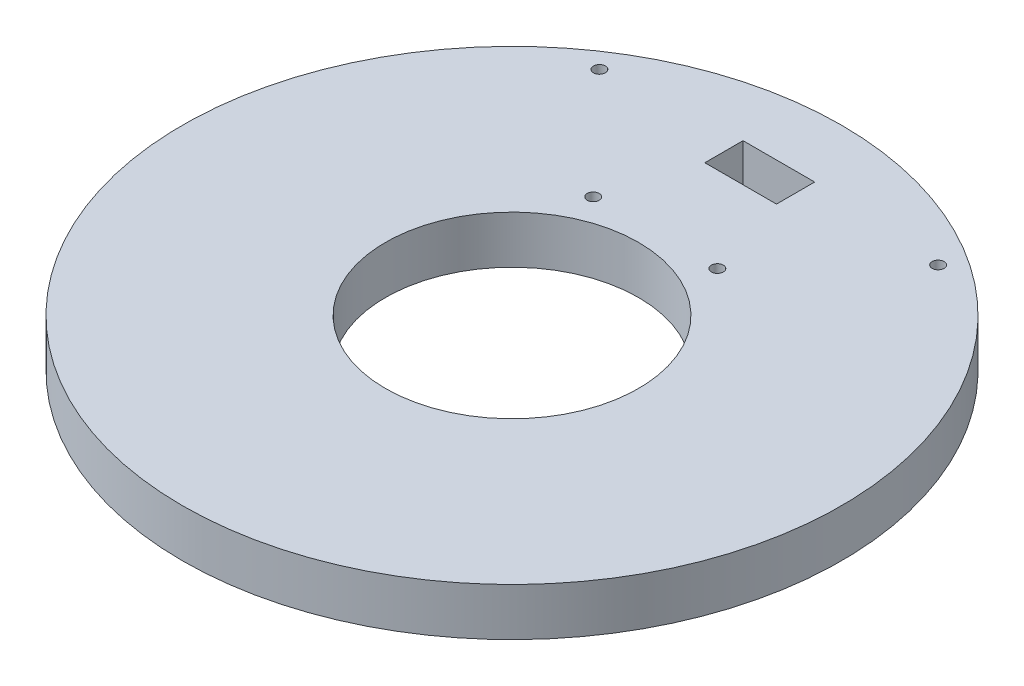
ISO-10303-21;
HEADER;
FILE_DESCRIPTION(('STEP AP214'),'2;1');
FILE_NAME('part.step','',(''),(''),'','','');
FILE_SCHEMA(('AUTOMOTIVE_DESIGN { 1 0 10303 214 1 1 1 1 }'));
ENDSEC;
DATA;
#1=APPLICATION_CONTEXT('core data for automotive mechanical design processes');
#2=APPLICATION_PROTOCOL_DEFINITION('international standard','automotive_design',2000,#1);
#3=PRODUCT_CONTEXT('',#1,'mechanical');
#4=PRODUCT('Part','Part','',(#3));
#5=PRODUCT_RELATED_PRODUCT_CATEGORY('part','',(#4));
#6=PRODUCT_DEFINITION_FORMATION('','',#4);
#7=PRODUCT_DEFINITION_CONTEXT('part definition',#1,'design');
#8=PRODUCT_DEFINITION('design','',#6,#7);
#9=PRODUCT_DEFINITION_SHAPE('','',#8);
#10=(LENGTH_UNIT() NAMED_UNIT(*) SI_UNIT(.MILLI.,.METRE.));
#11=(NAMED_UNIT(*) PLANE_ANGLE_UNIT() SI_UNIT($,.RADIAN.));
#12=(NAMED_UNIT(*) SI_UNIT($,.STERADIAN.) SOLID_ANGLE_UNIT());
#13=UNCERTAINTY_MEASURE_WITH_UNIT(LENGTH_MEASURE(1.E-05),#10,'distance_accuracy_value','');
#14=(GEOMETRIC_REPRESENTATION_CONTEXT(3) GLOBAL_UNCERTAINTY_ASSIGNED_CONTEXT((#13)) GLOBAL_UNIT_ASSIGNED_CONTEXT((#10,
#11,#12)) REPRESENTATION_CONTEXT('',''));
#15=CARTESIAN_POINT('',(0.,0.,0.));
#16=DIRECTION('',(0.,0.,1.));
#17=DIRECTION('',(1.,0.,0.));
#18=AXIS2_PLACEMENT_3D('',#15,#16,#17);
#19=CARTESIAN_POINT('',(0.,0.,0.));
#20=DIRECTION('',(0.,1.,0.));
#21=DIRECTION('',(0.,0.,1.));
#22=AXIS2_PLACEMENT_3D('',#19,#20,#21);
#23=PLANE('',#22);
#24=CARTESIAN_POINT('',(43.,0.,-46.7252608339429));
#25=DIRECTION('',(0.,-1.,0.));
#26=DIRECTION('',(0.,0.,-1.));
#27=AXIS2_PLACEMENT_3D('',#24,#25,#26);
#28=CIRCLE('',#27,2.75);
#29=CARTESIAN_POINT('',(43.,0.,-49.4752608339429));
#30=VERTEX_POINT('',#29);
#31=EDGE_CURVE('E745',#30,#30,#28,.T.);
#32=ORIENTED_EDGE('',*,*,#31,.F.);
#33=EDGE_LOOP('',(#32));
#34=FACE_BOUND('',#33,.T.);
#35=CARTESIAN_POINT('',(-44.9012806053458,0.,44.9012806053458));
#36=DIRECTION('',(0.,-1.,0.));
#37=DIRECTION('',(0.,0.,-1.));
#38=AXIS2_PLACEMENT_3D('',#35,#36,#37);
#39=CIRCLE('',#38,2.75);
#40=CARTESIAN_POINT('',(-44.9012806053458,0.,42.1512806053458));
#41=VERTEX_POINT('',#40);
#42=EDGE_CURVE('E746',#41,#41,#39,.T.);
#43=ORIENTED_EDGE('',*,*,#42,.F.);
#44=EDGE_LOOP('',(#43));
#45=FACE_BOUND('',#44,.T.);
#46=CARTESIAN_POINT('',(44.9012806053458,0.,44.9012806053458));
#47=DIRECTION('',(0.,-1.,0.));
#48=DIRECTION('',(0.,0.,-1.));
#49=AXIS2_PLACEMENT_3D('',#46,#47,#48);
#50=CIRCLE('',#49,2.75);
#51=CARTESIAN_POINT('',(44.9012806053458,0.,42.1512806053458));
#52=VERTEX_POINT('',#51);
#53=EDGE_CURVE('E758',#52,#52,#50,.T.);
#54=ORIENTED_EDGE('',*,*,#53,.F.);
#55=EDGE_LOOP('',(#54));
#56=FACE_BOUND('',#55,.T.);
#57=CARTESIAN_POINT('',(-43.,0.,-46.7252608339429));
#58=DIRECTION('',(0.,-1.,0.));
#59=DIRECTION('',(0.,0.,-1.));
#60=AXIS2_PLACEMENT_3D('',#57,#58,#59);
#61=CIRCLE('',#60,2.75);
#62=CARTESIAN_POINT('',(-43.,0.,-49.4752608339429));
#63=VERTEX_POINT('',#62);
#64=EDGE_CURVE('E749',#63,#63,#61,.T.);
#65=ORIENTED_EDGE('',*,*,#64,.F.);
#66=EDGE_LOOP('',(#65));
#67=FACE_BOUND('',#66,.T.);
#68=DIRECTION('',(1.,0.,0.));
#69=VECTOR('',#68,1.);
#70=CARTESIAN_POINT('',(7.50000000000001,0.,-55.875));
#71=LINE('',#70,#69);
#72=CARTESIAN_POINT('',(-7.49999999999999,0.,-55.875));
#73=VERTEX_POINT('',#72);
#74=CARTESIAN_POINT('',(7.50000000000001,0.,-55.875));
#75=VERTEX_POINT('',#74);
#76=EDGE_CURVE('E208',#73,#75,#71,.T.);
#77=ORIENTED_EDGE('',*,*,#76,.F.);
#78=DIRECTION('',(0.,0.,-1.));
#79=VECTOR('',#78,1.);
#80=CARTESIAN_POINT('',(-7.49999999999999,0.,-55.875));
#81=LINE('',#80,#79);
#82=CARTESIAN_POINT('',(-7.49999999999999,0.,-47.875));
#83=VERTEX_POINT('',#82);
#84=EDGE_CURVE('E56',#83,#73,#81,.T.);
#85=ORIENTED_EDGE('',*,*,#84,.F.);
#86=DIRECTION('',(-1.,0.,0.));
#87=VECTOR('',#86,1.);
#88=CARTESIAN_POINT('',(7.50000000000001,0.,-47.875));
#89=LINE('',#88,#87);
#90=CARTESIAN_POINT('',(7.50000000000001,0.,-47.875));
#91=VERTEX_POINT('',#90);
#92=EDGE_CURVE('E196',#91,#83,#89,.T.);
#93=ORIENTED_EDGE('',*,*,#92,.F.);
#94=DIRECTION('',(0.,0.,1.));
#95=VECTOR('',#94,1.);
#96=CARTESIAN_POINT('',(7.50000000000001,0.,-55.875));
#97=LINE('',#96,#95);
#98=EDGE_CURVE('E199',#75,#91,#97,.T.);
#99=ORIENTED_EDGE('',*,*,#98,.F.);
#100=EDGE_LOOP('',(#77,#85,#93,#99));
#101=FACE_BOUND('',#100,.T.);
#102=DIRECTION('',(-0.707106781186548,0.,0.707106781186547));
#103=VECTOR('',#102,1.);
#104=CARTESIAN_POINT('',(-10.6213203435597,0.,-10.6213203435597));
#105=LINE('',#104,#103);
#106=CARTESIAN_POINT('',(13.,0.,-34.2426406871193));
#107=VERTEX_POINT('',#106);
#108=CARTESIAN_POINT('',(8.7573593128807,0.,-30.));
#109=VERTEX_POINT('',#108);
#110=EDGE_CURVE('E263',#107,#109,#105,.T.);
#111=ORIENTED_EDGE('',*,*,#110,.T.);
#112=DIRECTION('',(-0.707106781186548,0.,-0.707106781186547));
#113=VECTOR('',#112,1.);
#114=CARTESIAN_POINT('',(19.3786796564403,0.,-19.3786796564404));
#115=LINE('',#114,#113);
#116=CARTESIAN_POINT('',(13.,0.,-25.7573593128807));
#117=VERTEX_POINT('',#116);
#118=EDGE_CURVE('E254',#117,#109,#115,.T.);
#119=ORIENTED_EDGE('',*,*,#118,.F.);
#120=DIRECTION('',(-0.707106781186547,0.,0.707106781186548));
#121=VECTOR('',#120,1.);
#122=CARTESIAN_POINT('',(-6.37867965644036,0.,-6.37867965644036));
#123=LINE('',#122,#121);
#124=CARTESIAN_POINT('',(17.2426406871193,0.,-30.));
#125=VERTEX_POINT('',#124);
#126=EDGE_CURVE('E270',#125,#117,#123,.T.);
#127=ORIENTED_EDGE('',*,*,#126,.F.);
#128=DIRECTION('',(-0.707106781186548,0.,-0.707106781186547));
#129=VECTOR('',#128,1.);
#130=CARTESIAN_POINT('',(23.6213203435596,0.,-23.6213203435596));
#131=LINE('',#130,#129);
#132=EDGE_CURVE('E266',#125,#107,#131,.T.);
#133=ORIENTED_EDGE('',*,*,#132,.T.);
#134=EDGE_LOOP('',(#111,#119,#127,#133));
#135=FACE_BOUND('',#134,.T.);
#136=DIRECTION('',(-0.707106781186548,0.,0.707106781186547));
#137=VECTOR('',#136,1.);
#138=CARTESIAN_POINT('',(-23.6213203435596,0.,-23.6213203435597));
#139=LINE('',#138,#137);
#140=CARTESIAN_POINT('',(-13.,0.,-34.2426406871193));
#141=VERTEX_POINT('',#140);
#142=CARTESIAN_POINT('',(-17.2426406871193,0.,-30.));
#143=VERTEX_POINT('',#142);
#144=EDGE_CURVE('E244',#141,#143,#139,.T.);
#145=ORIENTED_EDGE('',*,*,#144,.T.);
#146=DIRECTION('',(-0.707106781186547,0.,-0.707106781186548));
#147=VECTOR('',#146,1.);
#148=CARTESIAN_POINT('',(6.37867965644036,0.,-6.37867965644035));
#149=LINE('',#148,#147);
#150=CARTESIAN_POINT('',(-13.,0.,-25.7573593128807));
#151=VERTEX_POINT('',#150);
#152=EDGE_CURVE('E314',#151,#143,#149,.T.);
#153=ORIENTED_EDGE('',*,*,#152,.F.);
#154=DIRECTION('',(-0.707106781186547,0.,0.707106781186548));
#155=VECTOR('',#154,1.);
#156=CARTESIAN_POINT('',(-19.3786796564404,0.,-19.3786796564404));
#157=LINE('',#156,#155);
#158=CARTESIAN_POINT('',(-8.75735931288072,0.,-30.));
#159=VERTEX_POINT('',#158);
#160=EDGE_CURVE('E328',#159,#151,#157,.T.);
#161=ORIENTED_EDGE('',*,*,#160,.F.);
#162=DIRECTION('',(-0.707106781186548,0.,-0.707106781186547));
#163=VECTOR('',#162,1.);
#164=CARTESIAN_POINT('',(10.6213203435597,0.,-10.6213203435597));
#165=LINE('',#164,#163);
#166=EDGE_CURVE('E325',#159,#141,#165,.T.);
#167=ORIENTED_EDGE('',*,*,#166,.T.);
#168=EDGE_LOOP('',(#145,#153,#161,#167));
#169=FACE_BOUND('',#168,.T.);
#170=CARTESIAN_POINT('',(0.,0.,0.));
#171=DIRECTION('',(0.,1.,0.));
#172=DIRECTION('',(0.,0.,1.));
#173=AXIS2_PLACEMENT_3D('',#170,#171,#172);
#174=CIRCLE('',#173,69.);
#175=CARTESIAN_POINT('',(0.,0.,69.));
#176=VERTEX_POINT('',#175);
#177=EDGE_CURVE('E48',#176,#176,#174,.T.);
#178=ORIENTED_EDGE('',*,*,#177,.F.);
#179=EDGE_LOOP('',(#178));
#180=FACE_BOUND('',#179,.T.);
#181=CARTESIAN_POINT('',(0.,0.,0.));
#182=DIRECTION('',(0.,1.,0.));
#183=DIRECTION('',(0.,0.,1.));
#184=AXIS2_PLACEMENT_3D('',#181,#182,#183);
#185=CIRCLE('',#184,26.5);
#186=CARTESIAN_POINT('',(0.,0.,26.5));
#187=VERTEX_POINT('',#186);
#188=EDGE_CURVE('E335',#187,#187,#185,.T.);
#189=ORIENTED_EDGE('',*,*,#188,.T.);
#190=EDGE_LOOP('',(#189));
#191=FACE_BOUND('',#190,.T.);
#192=DIRECTION('',(-0.707106781186547,0.,0.707106781186548));
#193=VECTOR('',#192,1.);
#194=CARTESIAN_POINT('',(-46.7304404928503,0.,-46.7304404928502));
#195=LINE('',#194,#193);
#196=CARTESIAN_POINT('',(-35.46,0.,-58.0008809857005));
#197=VERTEX_POINT('',#196);
#198=CARTESIAN_POINT('',(-39.7026406871193,0.,-53.7582402985812));
#199=VERTEX_POINT('',#198);
#200=EDGE_CURVE('E230',#197,#199,#195,.T.);
#201=ORIENTED_EDGE('',*,*,#200,.T.);
#202=DIRECTION('',(-0.707106781186549,0.,-0.707106781186546));
#203=VECTOR('',#202,1.);
#204=CARTESIAN_POINT('',(7.02779980573102,0.,-7.02779980573104));
#205=LINE('',#204,#203);
#206=CARTESIAN_POINT('',(-35.46,0.,-49.5155996114619));
#207=VERTEX_POINT('',#206);
#208=EDGE_CURVE('E221',#207,#199,#205,.T.);
#209=ORIENTED_EDGE('',*,*,#208,.F.);
#210=DIRECTION('',(-0.707106781186547,0.,0.707106781186548));
#211=VECTOR('',#210,1.);
#212=CARTESIAN_POINT('',(-42.487799805731,0.,-42.4877998057309));
#213=LINE('',#212,#211);
#214=CARTESIAN_POINT('',(-31.2173593128807,0.,-53.7582402985812));
#215=VERTEX_POINT('',#214);
#216=EDGE_CURVE('E237',#215,#207,#213,.T.);
#217=ORIENTED_EDGE('',*,*,#216,.F.);
#218=DIRECTION('',(-0.707106781186548,0.,-0.707106781186548));
#219=VECTOR('',#218,1.);
#220=CARTESIAN_POINT('',(11.2704404928502,0.,-11.2704404928502));
#221=LINE('',#220,#219);
#222=EDGE_CURVE('E233',#215,#197,#221,.T.);
#223=ORIENTED_EDGE('',*,*,#222,.T.);
#224=EDGE_LOOP('',(#201,#209,#217,#223));
#225=FACE_BOUND('',#224,.T.);
#226=DIRECTION('',(-0.707106781186548,0.,0.707106781186548));
#227=VECTOR('',#226,1.);
#228=CARTESIAN_POINT('',(-11.2704404928502,0.,-11.2704404928502));
#229=LINE('',#228,#227);
#230=CARTESIAN_POINT('',(35.46,0.,-58.0008809857005));
#231=VERTEX_POINT('',#230);
#232=CARTESIAN_POINT('',(31.2173593128807,0.,-53.7582402985812));
#233=VERTEX_POINT('',#232);
#234=EDGE_CURVE('E214',#231,#233,#229,.T.);
#235=ORIENTED_EDGE('',*,*,#234,.T.);
#236=DIRECTION('',(-0.707106781186547,0.,-0.707106781186548));
#237=VECTOR('',#236,1.);
#238=CARTESIAN_POINT('',(42.487799805731,0.,-42.4877998057309));
#239=LINE('',#238,#237);
#240=CARTESIAN_POINT('',(35.46,0.,-49.5155996114619));
#241=VERTEX_POINT('',#240);
#242=EDGE_CURVE('E285',#241,#233,#239,.T.);
#243=ORIENTED_EDGE('',*,*,#242,.F.);
#244=DIRECTION('',(-0.707106781186547,0.,0.707106781186548));
#245=VECTOR('',#244,1.);
#246=CARTESIAN_POINT('',(-7.02779980573092,0.,-7.02779980573091));
#247=LINE('',#246,#245);
#248=CARTESIAN_POINT('',(39.7026406871193,0.,-53.7582402985812));
#249=VERTEX_POINT('',#248);
#250=EDGE_CURVE('E299',#249,#241,#247,.T.);
#251=ORIENTED_EDGE('',*,*,#250,.F.);
#252=DIRECTION('',(-0.707106781186548,0.,-0.707106781186548));
#253=VECTOR('',#252,1.);
#254=CARTESIAN_POINT('',(46.7304404928503,0.,-46.7304404928503));
#255=LINE('',#254,#253);
#256=EDGE_CURVE('E296',#249,#231,#255,.T.);
#257=ORIENTED_EDGE('',*,*,#256,.T.);
#258=EDGE_LOOP('',(#235,#243,#251,#257));
#259=FACE_BOUND('',#258,.T.);
#260=ADVANCED_FACE('F39',(#34,#45,#56,#67,#101,#135,#169,#180,#191,#225,#259),#23,.F.);
#261=CARTESIAN_POINT('',(0.,10.,0.));
#262=DIRECTION('',(0.,1.,0.));
#263=DIRECTION('',(0.,0.,1.));
#264=AXIS2_PLACEMENT_3D('',#261,#262,#263);
#265=PLANE('',#264);
#266=CARTESIAN_POINT('',(35.46,10.,-53.7582402985812));
#267=DIRECTION('',(0.,-1.,0.));
#268=DIRECTION('',(0.,0.,-1.));
#269=AXIS2_PLACEMENT_3D('',#266,#267,#268);
#270=CIRCLE('',#269,1.25);
#271=CARTESIAN_POINT('',(35.46,10.,-55.0082402985812));
#272=VERTEX_POINT('',#271);
#273=EDGE_CURVE('E762',#272,#272,#270,.T.);
#274=ORIENTED_EDGE('',*,*,#273,.T.);
#275=EDGE_LOOP('',(#274));
#276=FACE_BOUND('',#275,.T.);
#277=CARTESIAN_POINT('',(-35.46,10.,-53.7582402985812));
#278=DIRECTION('',(0.,-1.,0.));
#279=DIRECTION('',(0.,0.,-1.));
#280=AXIS2_PLACEMENT_3D('',#277,#278,#279);
#281=CIRCLE('',#280,1.25);
#282=CARTESIAN_POINT('',(-35.46,10.,-55.0082402985812));
#283=VERTEX_POINT('',#282);
#284=EDGE_CURVE('E768',#283,#283,#281,.T.);
#285=ORIENTED_EDGE('',*,*,#284,.T.);
#286=EDGE_LOOP('',(#285));
#287=FACE_BOUND('',#286,.T.);
#288=CARTESIAN_POINT('',(13.,10.,-30.));
#289=DIRECTION('',(0.,-1.,0.));
#290=DIRECTION('',(0.,0.,-1.));
#291=AXIS2_PLACEMENT_3D('',#288,#289,#290);
#292=CIRCLE('',#291,1.25);
#293=CARTESIAN_POINT('',(13.,10.,-31.25));
#294=VERTEX_POINT('',#293);
#295=EDGE_CURVE('E765',#294,#294,#292,.T.);
#296=ORIENTED_EDGE('',*,*,#295,.T.);
#297=EDGE_LOOP('',(#296));
#298=FACE_BOUND('',#297,.T.);
#299=CARTESIAN_POINT('',(-13.,10.,-30.));
#300=DIRECTION('',(0.,-1.,0.));
#301=DIRECTION('',(0.,0.,-1.));
#302=AXIS2_PLACEMENT_3D('',#299,#300,#301);
#303=CIRCLE('',#302,1.25);
#304=CARTESIAN_POINT('',(-13.,10.,-31.25));
#305=VERTEX_POINT('',#304);
#306=EDGE_CURVE('E202',#305,#305,#303,.T.);
#307=ORIENTED_EDGE('',*,*,#306,.T.);
#308=EDGE_LOOP('',(#307));
#309=FACE_BOUND('',#308,.T.);
#310=DIRECTION('',(0.,0.,-1.));
#311=VECTOR('',#310,1.);
#312=CARTESIAN_POINT('',(-7.49999999999999,10.,-55.875));
#313=LINE('',#312,#311);
#314=CARTESIAN_POINT('',(-7.49999999999999,10.,-47.875));
#315=VERTEX_POINT('',#314);
#316=CARTESIAN_POINT('',(-7.49999999999999,10.,-55.875));
#317=VERTEX_POINT('',#316);
#318=EDGE_CURVE('E180',#315,#317,#313,.T.);
#319=ORIENTED_EDGE('',*,*,#318,.T.);
#320=DIRECTION('',(1.,0.,0.));
#321=VECTOR('',#320,1.);
#322=CARTESIAN_POINT('',(7.50000000000001,10.,-55.875));
#323=LINE('',#322,#321);
#324=CARTESIAN_POINT('',(7.50000000000001,10.,-55.875));
#325=VERTEX_POINT('',#324);
#326=EDGE_CURVE('E189',#317,#325,#323,.T.);
#327=ORIENTED_EDGE('',*,*,#326,.T.);
#328=DIRECTION('',(0.,0.,1.));
#329=VECTOR('',#328,1.);
#330=CARTESIAN_POINT('',(7.50000000000001,10.,-55.875));
#331=LINE('',#330,#329);
#332=CARTESIAN_POINT('',(7.50000000000001,10.,-47.875));
#333=VERTEX_POINT('',#332);
#334=EDGE_CURVE('E64',#325,#333,#331,.T.);
#335=ORIENTED_EDGE('',*,*,#334,.T.);
#336=DIRECTION('',(-1.,0.,0.));
#337=VECTOR('',#336,1.);
#338=CARTESIAN_POINT('',(7.50000000000001,10.,-47.875));
#339=LINE('',#338,#337);
#340=EDGE_CURVE('E186',#333,#315,#339,.T.);
#341=ORIENTED_EDGE('',*,*,#340,.T.);
#342=EDGE_LOOP('',(#319,#327,#335,#341));
#343=FACE_BOUND('',#342,.T.);
#344=CARTESIAN_POINT('',(0.,10.,0.));
#345=DIRECTION('',(0.,1.,0.));
#346=DIRECTION('',(0.,0.,1.));
#347=AXIS2_PLACEMENT_3D('',#344,#345,#346);
#348=CIRCLE('',#347,69.);
#349=CARTESIAN_POINT('',(0.,10.,69.));
#350=VERTEX_POINT('',#349);
#351=EDGE_CURVE('E11',#350,#350,#348,.T.);
#352=ORIENTED_EDGE('',*,*,#351,.T.);
#353=EDGE_LOOP('',(#352));
#354=FACE_BOUND('',#353,.T.);
#355=CARTESIAN_POINT('',(0.,10.,0.));
#356=DIRECTION('',(0.,1.,0.));
#357=DIRECTION('',(0.,0.,1.));
#358=AXIS2_PLACEMENT_3D('',#355,#356,#357);
#359=CIRCLE('',#358,26.5);
#360=CARTESIAN_POINT('',(0.,10.,26.5));
#361=VERTEX_POINT('',#360);
#362=EDGE_CURVE('E342',#361,#361,#359,.T.);
#363=ORIENTED_EDGE('',*,*,#362,.F.);
#364=EDGE_LOOP('',(#363));
#365=FACE_BOUND('',#364,.T.);
#366=ADVANCED_FACE('F193',(#276,#287,#298,#309,#343,#354,#365),#265,.T.);
#367=CARTESIAN_POINT('',(0.,10.,0.));
#368=DIRECTION('',(0.,-1.,0.));
#369=DIRECTION('',(0.,0.,-1.));
#370=AXIS2_PLACEMENT_3D('',#367,#368,#369);
#371=CYLINDRICAL_SURFACE('',#370,69.);
#372=ORIENTED_EDGE('',*,*,#351,.F.);
#373=EDGE_LOOP('',(#372));
#374=FACE_BOUND('',#373,.T.);
#375=ORIENTED_EDGE('',*,*,#177,.T.);
#376=EDGE_LOOP('',(#375));
#377=FACE_BOUND('',#376,.T.);
#378=ADVANCED_FACE('F41',(#374,#377),#371,.T.);
#379=CARTESIAN_POINT('',(0.,10.,0.));
#380=DIRECTION('',(0.,-1.,0.));
#381=DIRECTION('',(0.,0.,-1.));
#382=AXIS2_PLACEMENT_3D('',#379,#380,#381);
#383=CYLINDRICAL_SURFACE('',#382,26.5);
#384=ORIENTED_EDGE('',*,*,#362,.T.);
#385=EDGE_LOOP('',(#384));
#386=FACE_BOUND('',#385,.T.);
#387=ORIENTED_EDGE('',*,*,#188,.F.);
#388=EDGE_LOOP('',(#387));
#389=FACE_BOUND('',#388,.T.);
#390=ADVANCED_FACE('F408',(#386,#389),#383,.F.);
#391=CARTESIAN_POINT('',(-23.6213203435596,4.5,-23.6213203435597));
#392=DIRECTION('',(0.707106781186547,0.,0.707106781186548));
#393=DIRECTION('',(0.707106781186548,0.,-0.707106781186547));
#394=AXIS2_PLACEMENT_3D('',#391,#392,#393);
#395=PLANE('',#394);
#396=ORIENTED_EDGE('',*,*,#144,.F.);
#397=DIRECTION('',(0.,-1.,0.));
#398=VECTOR('',#397,1.);
#399=CARTESIAN_POINT('',(-13.,4.5,-34.2426406871193));
#400=LINE('',#399,#398);
#401=CARTESIAN_POINT('',(-13.,4.5,-34.2426406871193));
#402=VERTEX_POINT('',#401);
#403=EDGE_CURVE('E322',#402,#141,#400,.T.);
#404=ORIENTED_EDGE('',*,*,#403,.F.);
#405=DIRECTION('',(-0.707106781186548,0.,0.707106781186547));
#406=VECTOR('',#405,1.);
#407=CARTESIAN_POINT('',(-23.6213203435596,4.5,-23.6213203435597));
#408=LINE('',#407,#406);
#409=CARTESIAN_POINT('',(-17.2426406871193,4.5,-30.));
#410=VERTEX_POINT('',#409);
#411=EDGE_CURVE('E311',#402,#410,#408,.T.);
#412=ORIENTED_EDGE('',*,*,#411,.T.);
#413=DIRECTION('',(0.,-1.,0.));
#414=VECTOR('',#413,1.);
#415=CARTESIAN_POINT('',(-17.2426406871193,4.5,-30.));
#416=LINE('',#415,#414);
#417=EDGE_CURVE('E333',#410,#143,#416,.T.);
#418=ORIENTED_EDGE('',*,*,#417,.T.);
#419=EDGE_LOOP('',(#396,#404,#412,#418));
#420=FACE_BOUND('',#419,.T.);
#421=ADVANCED_FACE('F377',(#420),#395,.T.);
#422=CARTESIAN_POINT('',(6.37867965644036,4.5,-6.37867965644035));
#423=DIRECTION('',(-0.707106781186548,0.,0.707106781186547));
#424=DIRECTION('',(0.707106781186547,0.,0.707106781186548));
#425=AXIS2_PLACEMENT_3D('',#422,#423,#424);
#426=PLANE('',#425);
#427=ORIENTED_EDGE('',*,*,#152,.T.);
#428=ORIENTED_EDGE('',*,*,#417,.F.);
#429=DIRECTION('',(-0.707106781186547,0.,-0.707106781186548));
#430=VECTOR('',#429,1.);
#431=CARTESIAN_POINT('',(6.37867965644036,4.5,-6.37867965644035));
#432=LINE('',#431,#430);
#433=CARTESIAN_POINT('',(-13.,4.5,-25.7573593128807));
#434=VERTEX_POINT('',#433);
#435=EDGE_CURVE('E319',#434,#410,#432,.T.);
#436=ORIENTED_EDGE('',*,*,#435,.F.);
#437=DIRECTION('',(0.,-1.,0.));
#438=VECTOR('',#437,1.);
#439=CARTESIAN_POINT('',(-13.,4.5,-25.7573593128807));
#440=LINE('',#439,#438);
#441=EDGE_CURVE('E336',#434,#151,#440,.T.);
#442=ORIENTED_EDGE('',*,*,#441,.T.);
#443=EDGE_LOOP('',(#427,#428,#436,#442));
#444=FACE_BOUND('',#443,.T.);
#445=ADVANCED_FACE('F379',(#444),#426,.F.);
#446=CARTESIAN_POINT('',(-19.3786796564404,4.5,-19.3786796564404));
#447=DIRECTION('',(0.707106781186548,0.,0.707106781186547));
#448=DIRECTION('',(0.707106781186547,0.,-0.707106781186548));
#449=AXIS2_PLACEMENT_3D('',#446,#447,#448);
#450=PLANE('',#449);
#451=ORIENTED_EDGE('',*,*,#160,.T.);
#452=ORIENTED_EDGE('',*,*,#441,.F.);
#453=DIRECTION('',(-0.707106781186547,0.,0.707106781186548));
#454=VECTOR('',#453,1.);
#455=CARTESIAN_POINT('',(-19.3786796564404,4.5,-19.3786796564404));
#456=LINE('',#455,#454);
#457=CARTESIAN_POINT('',(-8.75735931288072,4.5,-30.));
#458=VERTEX_POINT('',#457);
#459=EDGE_CURVE('E316',#458,#434,#456,.T.);
#460=ORIENTED_EDGE('',*,*,#459,.F.);
#461=DIRECTION('',(0.,-1.,0.));
#462=VECTOR('',#461,1.);
#463=CARTESIAN_POINT('',(-8.75735931288072,4.5,-30.));
#464=LINE('',#463,#462);
#465=EDGE_CURVE('E338',#458,#159,#464,.T.);
#466=ORIENTED_EDGE('',*,*,#465,.T.);
#467=EDGE_LOOP('',(#451,#452,#460,#466));
#468=FACE_BOUND('',#467,.T.);
#469=ADVANCED_FACE('F387',(#468),#450,.F.);
#470=CARTESIAN_POINT('',(10.6213203435597,4.5,-10.6213203435597));
#471=DIRECTION('',(-0.707106781186547,0.,0.707106781186548));
#472=DIRECTION('',(0.707106781186548,0.,0.707106781186547));
#473=AXIS2_PLACEMENT_3D('',#470,#471,#472);
#474=PLANE('',#473);
#475=ORIENTED_EDGE('',*,*,#166,.F.);
#476=ORIENTED_EDGE('',*,*,#465,.F.);
#477=DIRECTION('',(-0.707106781186548,0.,-0.707106781186547));
#478=VECTOR('',#477,1.);
#479=CARTESIAN_POINT('',(10.6213203435597,4.5,-10.6213203435597));
#480=LINE('',#479,#478);
#481=EDGE_CURVE('E313',#458,#402,#480,.T.);
#482=ORIENTED_EDGE('',*,*,#481,.T.);
#483=ORIENTED_EDGE('',*,*,#403,.T.);
#484=EDGE_LOOP('',(#475,#476,#482,#483));
#485=FACE_BOUND('',#484,.T.);
#486=ADVANCED_FACE('F368',(#485),#474,.T.);
#487=CARTESIAN_POINT('',(0.,4.5,0.));
#488=DIRECTION('',(0.,-1.,0.));
#489=DIRECTION('',(0.,0.,-1.));
#490=AXIS2_PLACEMENT_3D('',#487,#488,#489);
#491=PLANE('',#490);
#492=CARTESIAN_POINT('',(-13.,4.5,-30.));
#493=DIRECTION('',(0.,-1.,0.));
#494=DIRECTION('',(0.,0.,-1.));
#495=AXIS2_PLACEMENT_3D('',#492,#493,#494);
#496=CIRCLE('',#495,1.25);
#497=CARTESIAN_POINT('',(-13.,4.5,-31.25));
#498=VERTEX_POINT('',#497);
#499=EDGE_CURVE('E43',#498,#498,#496,.T.);
#500=ORIENTED_EDGE('',*,*,#499,.F.);
#501=EDGE_LOOP('',(#500));
#502=FACE_BOUND('',#501,.T.);
#503=ORIENTED_EDGE('',*,*,#411,.F.);
#504=ORIENTED_EDGE('',*,*,#481,.F.);
#505=ORIENTED_EDGE('',*,*,#459,.T.);
#506=ORIENTED_EDGE('',*,*,#435,.T.);
#507=EDGE_LOOP('',(#503,#504,#505,#506));
#508=FACE_BOUND('',#507,.T.);
#509=ADVANCED_FACE('F364',(#502,#508),#491,.T.);
#510=CARTESIAN_POINT('',(-46.7304404928503,4.5,-46.7304404928502));
#511=DIRECTION('',(0.707106781186548,0.,0.707106781186547));
#512=DIRECTION('',(0.707106781186547,0.,-0.707106781186548));
#513=AXIS2_PLACEMENT_3D('',#510,#511,#512);
#514=PLANE('',#513);
#515=ORIENTED_EDGE('',*,*,#200,.F.);
#516=DIRECTION('',(0.,-1.,0.));
#517=VECTOR('',#516,1.);
#518=CARTESIAN_POINT('',(-35.46,4.5,-58.0008809857005));
#519=LINE('',#518,#517);
#520=CARTESIAN_POINT('',(-35.46,4.5,-58.0008809857005));
#521=VERTEX_POINT('',#520);
#522=EDGE_CURVE('E229',#521,#197,#519,.T.);
#523=ORIENTED_EDGE('',*,*,#522,.F.);
#524=DIRECTION('',(-0.707106781186547,0.,0.707106781186548));
#525=VECTOR('',#524,1.);
#526=CARTESIAN_POINT('',(-46.7304404928503,4.5,-46.7304404928502));
#527=LINE('',#526,#525);
#528=CARTESIAN_POINT('',(-39.7026406871193,4.5,-53.7582402985812));
#529=VERTEX_POINT('',#528);
#530=EDGE_CURVE('E218',#521,#529,#527,.T.);
#531=ORIENTED_EDGE('',*,*,#530,.T.);
#532=DIRECTION('',(0.,-1.,0.));
#533=VECTOR('',#532,1.);
#534=CARTESIAN_POINT('',(-39.7026406871193,4.5,-53.7582402985812));
#535=LINE('',#534,#533);
#536=EDGE_CURVE('E242',#529,#199,#535,.T.);
#537=ORIENTED_EDGE('',*,*,#536,.T.);
#538=EDGE_LOOP('',(#515,#523,#531,#537));
#539=FACE_BOUND('',#538,.T.);
#540=ADVANCED_FACE('F367',(#539),#514,.T.);
#541=CARTESIAN_POINT('',(7.02779980573102,4.5,-7.02779980573104));
#542=DIRECTION('',(-0.707106781186546,0.,0.707106781186549));
#543=DIRECTION('',(0.707106781186549,0.,0.707106781186546));
#544=AXIS2_PLACEMENT_3D('',#541,#542,#543);
#545=PLANE('',#544);
#546=ORIENTED_EDGE('',*,*,#208,.T.);
#547=ORIENTED_EDGE('',*,*,#536,.F.);
#548=DIRECTION('',(-0.707106781186549,0.,-0.707106781186546));
#549=VECTOR('',#548,1.);
#550=CARTESIAN_POINT('',(7.02779980573102,4.5,-7.02779980573104));
#551=LINE('',#550,#549);
#552=CARTESIAN_POINT('',(-35.46,4.5,-49.5155996114619));
#553=VERTEX_POINT('',#552);
#554=EDGE_CURVE('E226',#553,#529,#551,.T.);
#555=ORIENTED_EDGE('',*,*,#554,.F.);
#556=DIRECTION('',(0.,-1.,0.));
#557=VECTOR('',#556,1.);
#558=CARTESIAN_POINT('',(-35.46,4.5,-49.5155996114619));
#559=LINE('',#558,#557);
#560=EDGE_CURVE('E245',#553,#207,#559,.T.);
#561=ORIENTED_EDGE('',*,*,#560,.T.);
#562=EDGE_LOOP('',(#546,#547,#555,#561));
#563=FACE_BOUND('',#562,.T.);
#564=ADVANCED_FACE('F450',(#563),#545,.F.);
#565=CARTESIAN_POINT('',(-42.487799805731,4.5,-42.4877998057309));
#566=DIRECTION('',(0.707106781186548,0.,0.707106781186547));
#567=DIRECTION('',(0.707106781186547,0.,-0.707106781186548));
#568=AXIS2_PLACEMENT_3D('',#565,#566,#567);
#569=PLANE('',#568);
#570=ORIENTED_EDGE('',*,*,#216,.T.);
#571=ORIENTED_EDGE('',*,*,#560,.F.);
#572=DIRECTION('',(-0.707106781186547,0.,0.707106781186548));
#573=VECTOR('',#572,1.);
#574=CARTESIAN_POINT('',(-42.487799805731,4.5,-42.4877998057309));
#575=LINE('',#574,#573);
#576=CARTESIAN_POINT('',(-31.2173593128807,4.5,-53.7582402985812));
#577=VERTEX_POINT('',#576);
#578=EDGE_CURVE('E223',#577,#553,#575,.T.);
#579=ORIENTED_EDGE('',*,*,#578,.F.);
#580=DIRECTION('',(0.,-1.,0.));
#581=VECTOR('',#580,1.);
#582=CARTESIAN_POINT('',(-31.2173593128807,4.5,-53.7582402985812));
#583=LINE('',#582,#581);
#584=EDGE_CURVE('E247',#577,#215,#583,.T.);
#585=ORIENTED_EDGE('',*,*,#584,.T.);
#586=EDGE_LOOP('',(#570,#571,#579,#585));
#587=FACE_BOUND('',#586,.T.);
#588=ADVANCED_FACE('F460',(#587),#569,.F.);
#589=CARTESIAN_POINT('',(11.2704404928502,4.5,-11.2704404928502));
#590=DIRECTION('',(-0.707106781186547,0.,0.707106781186547));
#591=DIRECTION('',(0.707106781186548,0.,0.707106781186548));
#592=AXIS2_PLACEMENT_3D('',#589,#590,#591);
#593=PLANE('',#592);
#594=ORIENTED_EDGE('',*,*,#222,.F.);
#595=ORIENTED_EDGE('',*,*,#584,.F.);
#596=DIRECTION('',(-0.707106781186548,0.,-0.707106781186548));
#597=VECTOR('',#596,1.);
#598=CARTESIAN_POINT('',(11.2704404928502,4.5,-11.2704404928502));
#599=LINE('',#598,#597);
#600=EDGE_CURVE('E220',#577,#521,#599,.T.);
#601=ORIENTED_EDGE('',*,*,#600,.T.);
#602=ORIENTED_EDGE('',*,*,#522,.T.);
#603=EDGE_LOOP('',(#594,#595,#601,#602));
#604=FACE_BOUND('',#603,.T.);
#605=ADVANCED_FACE('F470',(#604),#593,.T.);
#606=CARTESIAN_POINT('',(0.,4.5,0.));
#607=DIRECTION('',(0.,-1.,0.));
#608=DIRECTION('',(0.,0.,-1.));
#609=AXIS2_PLACEMENT_3D('',#606,#607,#608);
#610=PLANE('',#609);
#611=CARTESIAN_POINT('',(-35.46,4.5,-53.7582402985812));
#612=DIRECTION('',(0.,-1.,0.));
#613=DIRECTION('',(0.,0.,-1.));
#614=AXIS2_PLACEMENT_3D('',#611,#612,#613);
#615=CIRCLE('',#614,1.25);
#616=CARTESIAN_POINT('',(-35.46,4.5,-55.0082402985812));
#617=VERTEX_POINT('',#616);
#618=EDGE_CURVE('E354',#617,#617,#615,.T.);
#619=ORIENTED_EDGE('',*,*,#618,.F.);
#620=EDGE_LOOP('',(#619));
#621=FACE_BOUND('',#620,.T.);
#622=ORIENTED_EDGE('',*,*,#530,.F.);
#623=ORIENTED_EDGE('',*,*,#600,.F.);
#624=ORIENTED_EDGE('',*,*,#578,.T.);
#625=ORIENTED_EDGE('',*,*,#554,.T.);
#626=EDGE_LOOP('',(#622,#623,#624,#625));
#627=FACE_BOUND('',#626,.T.);
#628=ADVANCED_FACE('F480',(#621,#627),#610,.T.);
#629=CARTESIAN_POINT('',(-10.6213203435597,4.5,-10.6213203435597));
#630=DIRECTION('',(0.707106781186547,0.,0.707106781186548));
#631=DIRECTION('',(0.707106781186548,0.,-0.707106781186547));
#632=AXIS2_PLACEMENT_3D('',#629,#630,#631);
#633=PLANE('',#632);
#634=ORIENTED_EDGE('',*,*,#110,.F.);
#635=DIRECTION('',(0.,-1.,0.));
#636=VECTOR('',#635,1.);
#637=CARTESIAN_POINT('',(13.,4.5,-34.2426406871193));
#638=LINE('',#637,#636);
#639=CARTESIAN_POINT('',(13.,4.5,-34.2426406871193));
#640=VERTEX_POINT('',#639);
#641=EDGE_CURVE('E262',#640,#107,#638,.T.);
#642=ORIENTED_EDGE('',*,*,#641,.F.);
#643=DIRECTION('',(-0.707106781186548,0.,0.707106781186547));
#644=VECTOR('',#643,1.);
#645=CARTESIAN_POINT('',(-10.6213203435597,4.5,-10.6213203435597));
#646=LINE('',#645,#644);
#647=CARTESIAN_POINT('',(8.7573593128807,4.5,-30.));
#648=VERTEX_POINT('',#647);
#649=EDGE_CURVE('E251',#640,#648,#646,.T.);
#650=ORIENTED_EDGE('',*,*,#649,.T.);
#651=DIRECTION('',(0.,-1.,0.));
#652=VECTOR('',#651,1.);
#653=CARTESIAN_POINT('',(8.7573593128807,4.5,-30.));
#654=LINE('',#653,#652);
#655=EDGE_CURVE('E234',#648,#109,#654,.T.);
#656=ORIENTED_EDGE('',*,*,#655,.T.);
#657=EDGE_LOOP('',(#634,#642,#650,#656));
#658=FACE_BOUND('',#657,.T.);
#659=ADVANCED_FACE('F490',(#658),#633,.T.);
#660=CARTESIAN_POINT('',(19.3786796564403,4.5,-19.3786796564404));
#661=DIRECTION('',(-0.707106781186547,0.,0.707106781186548));
#662=DIRECTION('',(0.707106781186548,0.,0.707106781186547));
#663=AXIS2_PLACEMENT_3D('',#660,#661,#662);
#664=PLANE('',#663);
#665=ORIENTED_EDGE('',*,*,#118,.T.);
#666=ORIENTED_EDGE('',*,*,#655,.F.);
#667=DIRECTION('',(-0.707106781186548,0.,-0.707106781186547));
#668=VECTOR('',#667,1.);
#669=CARTESIAN_POINT('',(19.3786796564403,4.5,-19.3786796564404));
#670=LINE('',#669,#668);
#671=CARTESIAN_POINT('',(13.,4.5,-25.7573593128807));
#672=VERTEX_POINT('',#671);
#673=EDGE_CURVE('E259',#672,#648,#670,.T.);
#674=ORIENTED_EDGE('',*,*,#673,.F.);
#675=DIRECTION('',(0.,-1.,0.));
#676=VECTOR('',#675,1.);
#677=CARTESIAN_POINT('',(13.,4.5,-25.7573593128807));
#678=LINE('',#677,#676);
#679=EDGE_CURVE('E276',#672,#117,#678,.T.);
#680=ORIENTED_EDGE('',*,*,#679,.T.);
#681=EDGE_LOOP('',(#665,#666,#674,#680));
#682=FACE_BOUND('',#681,.T.);
#683=ADVANCED_FACE('F500',(#682),#664,.F.);
#684=CARTESIAN_POINT('',(-6.37867965644036,4.5,-6.37867965644036));
#685=DIRECTION('',(0.707106781186548,0.,0.707106781186547));
#686=DIRECTION('',(0.707106781186547,0.,-0.707106781186548));
#687=AXIS2_PLACEMENT_3D('',#684,#685,#686);
#688=PLANE('',#687);
#689=ORIENTED_EDGE('',*,*,#126,.T.);
#690=ORIENTED_EDGE('',*,*,#679,.F.);
#691=DIRECTION('',(-0.707106781186547,0.,0.707106781186548));
#692=VECTOR('',#691,1.);
#693=CARTESIAN_POINT('',(-6.37867965644036,4.5,-6.37867965644036));
#694=LINE('',#693,#692);
#695=CARTESIAN_POINT('',(17.2426406871193,4.5,-30.));
#696=VERTEX_POINT('',#695);
#697=EDGE_CURVE('E256',#696,#672,#694,.T.);
#698=ORIENTED_EDGE('',*,*,#697,.F.);
#699=DIRECTION('',(0.,-1.,0.));
#700=VECTOR('',#699,1.);
#701=CARTESIAN_POINT('',(17.2426406871193,4.5,-30.));
#702=LINE('',#701,#700);
#703=EDGE_CURVE('E278',#696,#125,#702,.T.);
#704=ORIENTED_EDGE('',*,*,#703,.T.);
#705=EDGE_LOOP('',(#689,#690,#698,#704));
#706=FACE_BOUND('',#705,.T.);
#707=ADVANCED_FACE('F510',(#706),#688,.F.);
#708=CARTESIAN_POINT('',(23.6213203435596,4.5,-23.6213203435596));
#709=DIRECTION('',(-0.707106781186547,0.,0.707106781186548));
#710=DIRECTION('',(0.707106781186548,0.,0.707106781186547));
#711=AXIS2_PLACEMENT_3D('',#708,#709,#710);
#712=PLANE('',#711);
#713=ORIENTED_EDGE('',*,*,#132,.F.);
#714=ORIENTED_EDGE('',*,*,#703,.F.);
#715=DIRECTION('',(-0.707106781186548,0.,-0.707106781186547));
#716=VECTOR('',#715,1.);
#717=CARTESIAN_POINT('',(23.6213203435596,4.5,-23.6213203435596));
#718=LINE('',#717,#716);
#719=EDGE_CURVE('E253',#696,#640,#718,.T.);
#720=ORIENTED_EDGE('',*,*,#719,.T.);
#721=ORIENTED_EDGE('',*,*,#641,.T.);
#722=EDGE_LOOP('',(#713,#714,#720,#721));
#723=FACE_BOUND('',#722,.T.);
#724=ADVANCED_FACE('F520',(#723),#712,.T.);
#725=CARTESIAN_POINT('',(0.,4.5,0.));
#726=DIRECTION('',(0.,-1.,0.));
#727=DIRECTION('',(0.,0.,-1.));
#728=AXIS2_PLACEMENT_3D('',#725,#726,#727);
#729=PLANE('',#728);
#730=CARTESIAN_POINT('',(13.,4.5,-30.));
#731=DIRECTION('',(0.,-1.,0.));
#732=DIRECTION('',(0.,0.,-1.));
#733=AXIS2_PLACEMENT_3D('',#730,#731,#732);
#734=CIRCLE('',#733,1.25);
#735=CARTESIAN_POINT('',(13.,4.5,-31.25));
#736=VERTEX_POINT('',#735);
#737=EDGE_CURVE('E352',#736,#736,#734,.T.);
#738=ORIENTED_EDGE('',*,*,#737,.F.);
#739=EDGE_LOOP('',(#738));
#740=FACE_BOUND('',#739,.T.);
#741=ORIENTED_EDGE('',*,*,#649,.F.);
#742=ORIENTED_EDGE('',*,*,#719,.F.);
#743=ORIENTED_EDGE('',*,*,#697,.T.);
#744=ORIENTED_EDGE('',*,*,#673,.T.);
#745=EDGE_LOOP('',(#741,#742,#743,#744));
#746=FACE_BOUND('',#745,.T.);
#747=ADVANCED_FACE('F530',(#740,#746),#729,.T.);
#748=CARTESIAN_POINT('',(-11.2704404928502,4.5,-11.2704404928502));
#749=DIRECTION('',(0.707106781186547,0.,0.707106781186547));
#750=DIRECTION('',(0.707106781186548,0.,-0.707106781186548));
#751=AXIS2_PLACEMENT_3D('',#748,#749,#750);
#752=PLANE('',#751);
#753=ORIENTED_EDGE('',*,*,#234,.F.);
#754=DIRECTION('',(0.,-1.,0.));
#755=VECTOR('',#754,1.);
#756=CARTESIAN_POINT('',(35.46,4.5,-58.0008809857005));
#757=LINE('',#756,#755);
#758=CARTESIAN_POINT('',(35.46,4.5,-58.0008809857005));
#759=VERTEX_POINT('',#758);
#760=EDGE_CURVE('E293',#759,#231,#757,.T.);
#761=ORIENTED_EDGE('',*,*,#760,.F.);
#762=DIRECTION('',(-0.707106781186548,0.,0.707106781186548));
#763=VECTOR('',#762,1.);
#764=CARTESIAN_POINT('',(-11.2704404928502,4.5,-11.2704404928502));
#765=LINE('',#764,#763);
#766=CARTESIAN_POINT('',(31.2173593128807,4.5,-53.7582402985812));
#767=VERTEX_POINT('',#766);
#768=EDGE_CURVE('E282',#759,#767,#765,.T.);
#769=ORIENTED_EDGE('',*,*,#768,.T.);
#770=DIRECTION('',(0.,-1.,0.));
#771=VECTOR('',#770,1.);
#772=CARTESIAN_POINT('',(31.2173593128807,4.5,-53.7582402985812));
#773=LINE('',#772,#771);
#774=EDGE_CURVE('E267',#767,#233,#773,.T.);
#775=ORIENTED_EDGE('',*,*,#774,.T.);
#776=EDGE_LOOP('',(#753,#761,#769,#775));
#777=FACE_BOUND('',#776,.T.);
#778=ADVANCED_FACE('F540',(#777),#752,.T.);
#779=CARTESIAN_POINT('',(42.487799805731,4.5,-42.4877998057309));
#780=DIRECTION('',(-0.707106781186548,0.,0.707106781186547));
#781=DIRECTION('',(0.707106781186547,0.,0.707106781186548));
#782=AXIS2_PLACEMENT_3D('',#779,#780,#781);
#783=PLANE('',#782);
#784=ORIENTED_EDGE('',*,*,#242,.T.);
#785=ORIENTED_EDGE('',*,*,#774,.F.);
#786=DIRECTION('',(-0.707106781186547,0.,-0.707106781186548));
#787=VECTOR('',#786,1.);
#788=CARTESIAN_POINT('',(42.487799805731,4.5,-42.4877998057309));
#789=LINE('',#788,#787);
#790=CARTESIAN_POINT('',(35.46,4.5,-49.5155996114619));
#791=VERTEX_POINT('',#790);
#792=EDGE_CURVE('E290',#791,#767,#789,.T.);
#793=ORIENTED_EDGE('',*,*,#792,.F.);
#794=DIRECTION('',(0.,-1.,0.));
#795=VECTOR('',#794,1.);
#796=CARTESIAN_POINT('',(35.46,4.5,-49.5155996114619));
#797=LINE('',#796,#795);
#798=EDGE_CURVE('E305',#791,#241,#797,.T.);
#799=ORIENTED_EDGE('',*,*,#798,.T.);
#800=EDGE_LOOP('',(#784,#785,#793,#799));
#801=FACE_BOUND('',#800,.T.);
#802=ADVANCED_FACE('F550',(#801),#783,.F.);
#803=CARTESIAN_POINT('',(-7.02779980573092,4.5,-7.02779980573091));
#804=DIRECTION('',(0.707106781186548,0.,0.707106781186547));
#805=DIRECTION('',(0.707106781186547,0.,-0.707106781186548));
#806=AXIS2_PLACEMENT_3D('',#803,#804,#805);
#807=PLANE('',#806);
#808=ORIENTED_EDGE('',*,*,#250,.T.);
#809=ORIENTED_EDGE('',*,*,#798,.F.);
#810=DIRECTION('',(-0.707106781186547,0.,0.707106781186548));
#811=VECTOR('',#810,1.);
#812=CARTESIAN_POINT('',(-7.02779980573092,4.5,-7.02779980573091));
#813=LINE('',#812,#811);
#814=CARTESIAN_POINT('',(39.7026406871193,4.5,-53.7582402985812));
#815=VERTEX_POINT('',#814);
#816=EDGE_CURVE('E287',#815,#791,#813,.T.);
#817=ORIENTED_EDGE('',*,*,#816,.F.);
#818=DIRECTION('',(0.,-1.,0.));
#819=VECTOR('',#818,1.);
#820=CARTESIAN_POINT('',(39.7026406871193,4.5,-53.7582402985812));
#821=LINE('',#820,#819);
#822=EDGE_CURVE('E307',#815,#249,#821,.T.);
#823=ORIENTED_EDGE('',*,*,#822,.T.);
#824=EDGE_LOOP('',(#808,#809,#817,#823));
#825=FACE_BOUND('',#824,.T.);
#826=ADVANCED_FACE('F560',(#825),#807,.F.);
#827=CARTESIAN_POINT('',(46.7304404928503,4.5,-46.7304404928503));
#828=DIRECTION('',(-0.707106781186547,0.,0.707106781186547));
#829=DIRECTION('',(0.707106781186548,0.,0.707106781186548));
#830=AXIS2_PLACEMENT_3D('',#827,#828,#829);
#831=PLANE('',#830);
#832=ORIENTED_EDGE('',*,*,#256,.F.);
#833=ORIENTED_EDGE('',*,*,#822,.F.);
#834=DIRECTION('',(-0.707106781186548,0.,-0.707106781186548));
#835=VECTOR('',#834,1.);
#836=CARTESIAN_POINT('',(46.7304404928503,4.5,-46.7304404928503));
#837=LINE('',#836,#835);
#838=EDGE_CURVE('E284',#815,#759,#837,.T.);
#839=ORIENTED_EDGE('',*,*,#838,.T.);
#840=ORIENTED_EDGE('',*,*,#760,.T.);
#841=EDGE_LOOP('',(#832,#833,#839,#840));
#842=FACE_BOUND('',#841,.T.);
#843=ADVANCED_FACE('F570',(#842),#831,.T.);
#844=CARTESIAN_POINT('',(0.,4.5,0.));
#845=DIRECTION('',(0.,-1.,0.));
#846=DIRECTION('',(0.,0.,-1.));
#847=AXIS2_PLACEMENT_3D('',#844,#845,#846);
#848=PLANE('',#847);
#849=CARTESIAN_POINT('',(35.46,4.5,-53.7582402985812));
#850=DIRECTION('',(0.,-1.,0.));
#851=DIRECTION('',(0.,0.,-1.));
#852=AXIS2_PLACEMENT_3D('',#849,#850,#851);
#853=CIRCLE('',#852,1.25);
#854=CARTESIAN_POINT('',(35.46,4.5,-55.0082402985812));
#855=VERTEX_POINT('',#854);
#856=EDGE_CURVE('E349',#855,#855,#853,.T.);
#857=ORIENTED_EDGE('',*,*,#856,.F.);
#858=EDGE_LOOP('',(#857));
#859=FACE_BOUND('',#858,.T.);
#860=ORIENTED_EDGE('',*,*,#768,.F.);
#861=ORIENTED_EDGE('',*,*,#838,.F.);
#862=ORIENTED_EDGE('',*,*,#816,.T.);
#863=ORIENTED_EDGE('',*,*,#792,.T.);
#864=EDGE_LOOP('',(#860,#861,#862,#863));
#865=FACE_BOUND('',#864,.T.);
#866=ADVANCED_FACE('F580',(#859,#865),#848,.T.);
#867=CARTESIAN_POINT('',(-7.49999999999999,10.,-55.875));
#868=DIRECTION('',(-1.,0.,0.));
#869=DIRECTION('',(0.,0.,1.));
#870=AXIS2_PLACEMENT_3D('',#867,#868,#869);
#871=PLANE('',#870);
#872=ORIENTED_EDGE('',*,*,#84,.T.);
#873=DIRECTION('',(0.,-1.,0.));
#874=VECTOR('',#873,1.);
#875=CARTESIAN_POINT('',(-7.49999999999999,10.,-55.875));
#876=LINE('',#875,#874);
#877=EDGE_CURVE('E176',#317,#73,#876,.T.);
#878=ORIENTED_EDGE('',*,*,#877,.F.);
#879=ORIENTED_EDGE('',*,*,#318,.F.);
#880=DIRECTION('',(0.,-1.,0.));
#881=VECTOR('',#880,1.);
#882=CARTESIAN_POINT('',(-7.49999999999999,10.,-47.875));
#883=LINE('',#882,#881);
#884=EDGE_CURVE('E212',#315,#83,#883,.T.);
#885=ORIENTED_EDGE('',*,*,#884,.T.);
#886=EDGE_LOOP('',(#872,#878,#879,#885));
#887=FACE_BOUND('',#886,.T.);
#888=ADVANCED_FACE('F178',(#887),#871,.F.);
#889=CARTESIAN_POINT('',(7.50000000000001,10.,-47.875));
#890=DIRECTION('',(0.,0.,1.));
#891=DIRECTION('',(1.,0.,0.));
#892=AXIS2_PLACEMENT_3D('',#889,#890,#891);
#893=PLANE('',#892);
#894=ORIENTED_EDGE('',*,*,#92,.T.);
#895=ORIENTED_EDGE('',*,*,#884,.F.);
#896=ORIENTED_EDGE('',*,*,#340,.F.);
#897=DIRECTION('',(0.,-1.,0.));
#898=VECTOR('',#897,1.);
#899=CARTESIAN_POINT('',(7.50000000000001,10.,-47.875));
#900=LINE('',#899,#898);
#901=EDGE_CURVE('E215',#333,#91,#900,.T.);
#902=ORIENTED_EDGE('',*,*,#901,.T.);
#903=EDGE_LOOP('',(#894,#895,#896,#902));
#904=FACE_BOUND('',#903,.T.);
#905=ADVANCED_FACE('F599',(#904),#893,.F.);
#906=CARTESIAN_POINT('',(7.50000000000001,10.,-55.875));
#907=DIRECTION('',(1.,0.,0.));
#908=DIRECTION('',(0.,0.,-1.));
#909=AXIS2_PLACEMENT_3D('',#906,#907,#908);
#910=PLANE('',#909);
#911=ORIENTED_EDGE('',*,*,#98,.T.);
#912=ORIENTED_EDGE('',*,*,#901,.F.);
#913=ORIENTED_EDGE('',*,*,#334,.F.);
#914=DIRECTION('',(0.,-1.,0.));
#915=VECTOR('',#914,1.);
#916=CARTESIAN_POINT('',(7.50000000000001,10.,-55.875));
#917=LINE('',#916,#915);
#918=EDGE_CURVE('E185',#325,#75,#917,.T.);
#919=ORIENTED_EDGE('',*,*,#918,.T.);
#920=EDGE_LOOP('',(#911,#912,#913,#919));
#921=FACE_BOUND('',#920,.T.);
#922=ADVANCED_FACE('F608',(#921),#910,.F.);
#923=CARTESIAN_POINT('',(7.50000000000001,10.,-55.875));
#924=DIRECTION('',(0.,0.,-1.));
#925=DIRECTION('',(-1.,0.,0.));
#926=AXIS2_PLACEMENT_3D('',#923,#924,#925);
#927=PLANE('',#926);
#928=ORIENTED_EDGE('',*,*,#76,.T.);
#929=ORIENTED_EDGE('',*,*,#918,.F.);
#930=ORIENTED_EDGE('',*,*,#326,.F.);
#931=ORIENTED_EDGE('',*,*,#877,.T.);
#932=EDGE_LOOP('',(#928,#929,#930,#931));
#933=FACE_BOUND('',#932,.T.);
#934=ADVANCED_FACE('F190',(#933),#927,.F.);
#935=CARTESIAN_POINT('',(35.46,10.,-53.7582402985812));
#936=DIRECTION('',(0.,-1.,0.));
#937=DIRECTION('',(0.,0.,-1.));
#938=AXIS2_PLACEMENT_3D('',#935,#936,#937);
#939=CYLINDRICAL_SURFACE('',#938,1.25);
#940=ORIENTED_EDGE('',*,*,#856,.T.);
#941=EDGE_LOOP('',(#940));
#942=FACE_BOUND('',#941,.T.);
#943=ORIENTED_EDGE('',*,*,#273,.F.);
#944=EDGE_LOOP('',(#943));
#945=FACE_BOUND('',#944,.T.);
#946=ADVANCED_FACE('F626',(#942,#945),#939,.F.);
#947=CARTESIAN_POINT('',(13.,10.,-30.));
#948=DIRECTION('',(0.,-1.,0.));
#949=DIRECTION('',(0.,0.,-1.));
#950=AXIS2_PLACEMENT_3D('',#947,#948,#949);
#951=CYLINDRICAL_SURFACE('',#950,1.25);
#952=ORIENTED_EDGE('',*,*,#737,.T.);
#953=EDGE_LOOP('',(#952));
#954=FACE_BOUND('',#953,.T.);
#955=ORIENTED_EDGE('',*,*,#295,.F.);
#956=EDGE_LOOP('',(#955));
#957=FACE_BOUND('',#956,.T.);
#958=ADVANCED_FACE('F634',(#954,#957),#951,.F.);
#959=CARTESIAN_POINT('',(-35.46,10.,-53.7582402985812));
#960=DIRECTION('',(0.,-1.,0.));
#961=DIRECTION('',(0.,0.,-1.));
#962=AXIS2_PLACEMENT_3D('',#959,#960,#961);
#963=CYLINDRICAL_SURFACE('',#962,1.25);
#964=ORIENTED_EDGE('',*,*,#618,.T.);
#965=EDGE_LOOP('',(#964));
#966=FACE_BOUND('',#965,.T.);
#967=ORIENTED_EDGE('',*,*,#284,.F.);
#968=EDGE_LOOP('',(#967));
#969=FACE_BOUND('',#968,.T.);
#970=ADVANCED_FACE('F644',(#966,#969),#963,.F.);
#971=CARTESIAN_POINT('',(-13.,10.,-30.));
#972=DIRECTION('',(0.,-1.,0.));
#973=DIRECTION('',(0.,0.,-1.));
#974=AXIS2_PLACEMENT_3D('',#971,#972,#973);
#975=CYLINDRICAL_SURFACE('',#974,1.25);
#976=ORIENTED_EDGE('',*,*,#499,.T.);
#977=EDGE_LOOP('',(#976));
#978=FACE_BOUND('',#977,.T.);
#979=ORIENTED_EDGE('',*,*,#306,.F.);
#980=EDGE_LOOP('',(#979));
#981=FACE_BOUND('',#980,.T.);
#982=ADVANCED_FACE('F361',(#978,#981),#975,.F.);
#983=CARTESIAN_POINT('',(-43.,8.2,-46.7252608339429));
#984=DIRECTION('',(0.,-1.,0.));
#985=DIRECTION('',(0.,0.,-1.));
#986=AXIS2_PLACEMENT_3D('',#983,#984,#985);
#987=CYLINDRICAL_SURFACE('',#986,2.75);
#988=CARTESIAN_POINT('',(-43.,8.2,-46.7252608339429));
#989=DIRECTION('',(0.,-1.,0.));
#990=DIRECTION('',(0.,0.,-1.));
#991=AXIS2_PLACEMENT_3D('',#988,#989,#990);
#992=CIRCLE('',#991,2.75);
#993=CARTESIAN_POINT('',(-43.,8.2,-49.4752608339429));
#994=VERTEX_POINT('',#993);
#995=EDGE_CURVE('E759',#994,#994,#992,.T.);
#996=ORIENTED_EDGE('',*,*,#995,.F.);
#997=EDGE_LOOP('',(#996));
#998=FACE_BOUND('',#997,.T.);
#999=ORIENTED_EDGE('',*,*,#64,.T.);
#1000=EDGE_LOOP('',(#999));
#1001=FACE_BOUND('',#1000,.T.);
#1002=ADVANCED_FACE('F661',(#998,#1001),#987,.F.);
#1003=CARTESIAN_POINT('',(-43.,8.2,-46.7252608339429));
#1004=DIRECTION('',(0.,-1.,0.));
#1005=DIRECTION('',(0.,0.,-1.));
#1006=AXIS2_PLACEMENT_3D('',#1003,#1004,#1005);
#1007=PLANE('',#1006);
#1008=ORIENTED_EDGE('',*,*,#995,.T.);
#1009=EDGE_LOOP('',(#1008));
#1010=FACE_BOUND('',#1009,.T.);
#1011=ADVANCED_FACE('F669',(#1010),#1007,.T.);
#1012=CARTESIAN_POINT('',(44.9012806053458,8.2,44.9012806053458));
#1013=DIRECTION('',(0.,-1.,0.));
#1014=DIRECTION('',(0.,0.,-1.));
#1015=AXIS2_PLACEMENT_3D('',#1012,#1013,#1014);
#1016=CYLINDRICAL_SURFACE('',#1015,2.75);
#1017=CARTESIAN_POINT('',(44.9012806053458,8.2,44.9012806053458));
#1018=DIRECTION('',(0.,-1.,0.));
#1019=DIRECTION('',(0.,0.,-1.));
#1020=AXIS2_PLACEMENT_3D('',#1017,#1018,#1019);
#1021=CIRCLE('',#1020,2.75);
#1022=CARTESIAN_POINT('',(44.9012806053458,8.2,42.1512806053458));
#1023=VERTEX_POINT('',#1022);
#1024=EDGE_CURVE('E802',#1023,#1023,#1021,.T.);
#1025=ORIENTED_EDGE('',*,*,#1024,.F.);
#1026=EDGE_LOOP('',(#1025));
#1027=FACE_BOUND('',#1026,.T.);
#1028=ORIENTED_EDGE('',*,*,#53,.T.);
#1029=EDGE_LOOP('',(#1028));
#1030=FACE_BOUND('',#1029,.T.);
#1031=ADVANCED_FACE('F679',(#1027,#1030),#1016,.F.);
#1032=CARTESIAN_POINT('',(44.9012806053458,8.2,44.9012806053458));
#1033=DIRECTION('',(0.,-1.,0.));
#1034=DIRECTION('',(0.,0.,-1.));
#1035=AXIS2_PLACEMENT_3D('',#1032,#1033,#1034);
#1036=PLANE('',#1035);
#1037=ORIENTED_EDGE('',*,*,#1024,.T.);
#1038=EDGE_LOOP('',(#1037));
#1039=FACE_BOUND('',#1038,.T.);
#1040=ADVANCED_FACE('F689',(#1039),#1036,.T.);
#1041=CARTESIAN_POINT('',(-44.9012806053458,8.2,44.9012806053458));
#1042=DIRECTION('',(0.,-1.,0.));
#1043=DIRECTION('',(0.,0.,-1.));
#1044=AXIS2_PLACEMENT_3D('',#1041,#1042,#1043);
#1045=CYLINDRICAL_SURFACE('',#1044,2.75);
#1046=CARTESIAN_POINT('',(-44.9012806053458,8.2,44.9012806053458));
#1047=DIRECTION('',(0.,-1.,0.));
#1048=DIRECTION('',(0.,0.,-1.));
#1049=AXIS2_PLACEMENT_3D('',#1046,#1047,#1048);
#1050=CIRCLE('',#1049,2.75);
#1051=CARTESIAN_POINT('',(-44.9012806053458,8.2,42.1512806053458));
#1052=VERTEX_POINT('',#1051);
#1053=EDGE_CURVE('E752',#1052,#1052,#1050,.T.);
#1054=ORIENTED_EDGE('',*,*,#1053,.F.);
#1055=EDGE_LOOP('',(#1054));
#1056=FACE_BOUND('',#1055,.T.);
#1057=ORIENTED_EDGE('',*,*,#42,.T.);
#1058=EDGE_LOOP('',(#1057));
#1059=FACE_BOUND('',#1058,.T.);
#1060=ADVANCED_FACE('F699',(#1056,#1059),#1045,.F.);
#1061=CARTESIAN_POINT('',(-44.9012806053458,8.2,44.9012806053458));
#1062=DIRECTION('',(0.,-1.,0.));
#1063=DIRECTION('',(0.,0.,-1.));
#1064=AXIS2_PLACEMENT_3D('',#1061,#1062,#1063);
#1065=PLANE('',#1064);
#1066=ORIENTED_EDGE('',*,*,#1053,.T.);
#1067=EDGE_LOOP('',(#1066));
#1068=FACE_BOUND('',#1067,.T.);
#1069=ADVANCED_FACE('F709',(#1068),#1065,.T.);
#1070=CARTESIAN_POINT('',(43.,8.2,-46.7252608339429));
#1071=DIRECTION('',(0.,-1.,0.));
#1072=DIRECTION('',(0.,0.,-1.));
#1073=AXIS2_PLACEMENT_3D('',#1070,#1071,#1072);
#1074=CYLINDRICAL_SURFACE('',#1073,2.75);
#1075=CARTESIAN_POINT('',(43.,8.2,-46.7252608339429));
#1076=DIRECTION('',(0.,-1.,0.));
#1077=DIRECTION('',(0.,0.,-1.));
#1078=AXIS2_PLACEMENT_3D('',#1075,#1076,#1077);
#1079=CIRCLE('',#1078,2.75);
#1080=CARTESIAN_POINT('',(43.,8.2,-49.4752608339429));
#1081=VERTEX_POINT('',#1080);
#1082=EDGE_CURVE('E744',#1081,#1081,#1079,.T.);
#1083=ORIENTED_EDGE('',*,*,#1082,.F.);
#1084=EDGE_LOOP('',(#1083));
#1085=FACE_BOUND('',#1084,.T.);
#1086=ORIENTED_EDGE('',*,*,#31,.T.);
#1087=EDGE_LOOP('',(#1086));
#1088=FACE_BOUND('',#1087,.T.);
#1089=ADVANCED_FACE('F719',(#1085,#1088),#1074,.F.);
#1090=CARTESIAN_POINT('',(43.,8.2,-46.7252608339429));
#1091=DIRECTION('',(0.,-1.,0.));
#1092=DIRECTION('',(0.,0.,-1.));
#1093=AXIS2_PLACEMENT_3D('',#1090,#1091,#1092);
#1094=PLANE('',#1093);
#1095=ORIENTED_EDGE('',*,*,#1082,.T.);
#1096=EDGE_LOOP('',(#1095));
#1097=FACE_BOUND('',#1096,.T.);
#1098=ADVANCED_FACE('F729',(#1097),#1094,.T.);
#1099=CLOSED_SHELL('',(#260,#366,#378,#390,#421,#445,#469,#486,#509,#540,#564,#588,#605,#628,
#659,#683,#707,#724,#747,#778,#802,#826,#843,#866,#888,#905,#922,#934,#946,#958,#970,#982,#1002,
#1011,#1031,#1040,#1060,#1069,#1089,#1098));
#1100=MANIFOLD_SOLID_BREP('B2',#1099);
#1101=ADVANCED_BREP_SHAPE_REPRESENTATION('',(#18,#1100),#14);
#1102=SHAPE_DEFINITION_REPRESENTATION(#9,#1101);
ENDSEC;
END-ISO-10303-21;
